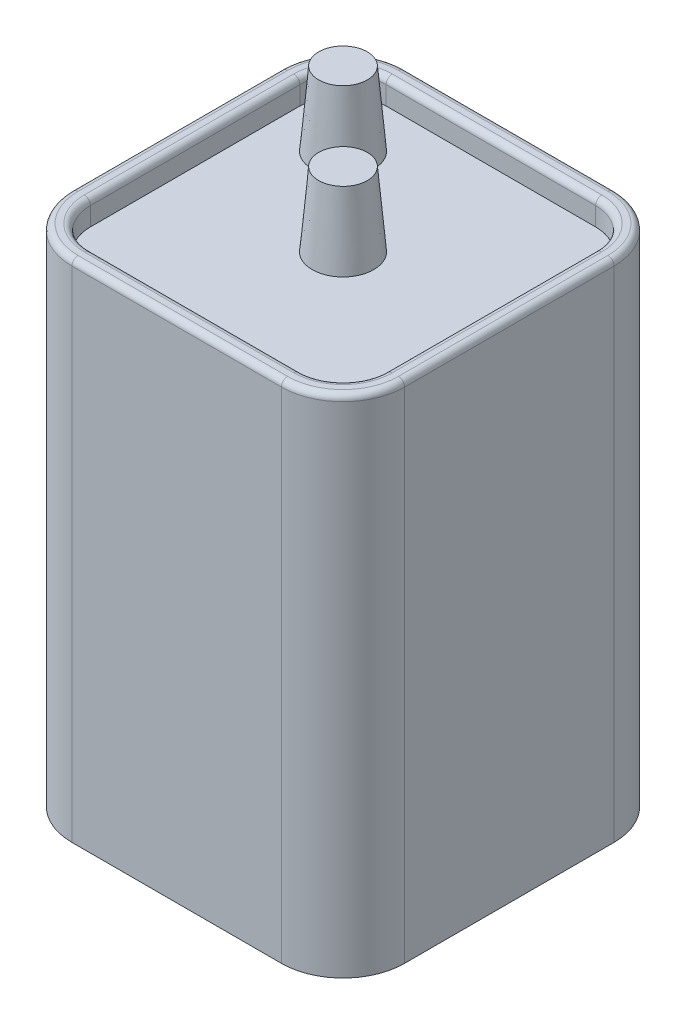
ISO-10303-21;
HEADER;
FILE_DESCRIPTION(('STEP AP214'),'2;1');
FILE_NAME('part.step','',(''),(''),'','','');
FILE_SCHEMA(('AUTOMOTIVE_DESIGN { 1 0 10303 214 1 1 1 1 }'));
ENDSEC;
DATA;
#1=APPLICATION_CONTEXT('core data for automotive mechanical design processes');
#2=APPLICATION_PROTOCOL_DEFINITION('international standard','automotive_design',2000,#1);
#3=PRODUCT_CONTEXT('',#1,'mechanical');
#4=PRODUCT('Part','Part','',(#3));
#5=PRODUCT_RELATED_PRODUCT_CATEGORY('part','',(#4));
#6=PRODUCT_DEFINITION_FORMATION('','',#4);
#7=PRODUCT_DEFINITION_CONTEXT('part definition',#1,'design');
#8=PRODUCT_DEFINITION('design','',#6,#7);
#9=PRODUCT_DEFINITION_SHAPE('','',#8);
#10=(LENGTH_UNIT() NAMED_UNIT(*) SI_UNIT(.MILLI.,.METRE.));
#11=(NAMED_UNIT(*) PLANE_ANGLE_UNIT() SI_UNIT($,.RADIAN.));
#12=(NAMED_UNIT(*) SI_UNIT($,.STERADIAN.) SOLID_ANGLE_UNIT());
#13=UNCERTAINTY_MEASURE_WITH_UNIT(LENGTH_MEASURE(1.E-05),#10,'distance_accuracy_value','');
#14=(GEOMETRIC_REPRESENTATION_CONTEXT(3) GLOBAL_UNCERTAINTY_ASSIGNED_CONTEXT((#13)) GLOBAL_UNIT_ASSIGNED_CONTEXT((#10,
#11,#12)) REPRESENTATION_CONTEXT('',''));
#15=CARTESIAN_POINT('',(0.,0.,0.));
#16=DIRECTION('',(0.,0.,1.));
#17=DIRECTION('',(1.,0.,0.));
#18=AXIS2_PLACEMENT_3D('',#15,#16,#17);
#19=CARTESIAN_POINT('',(34.29,104.14,-34.29));
#20=DIRECTION('',(-1.,0.,0.));
#21=DIRECTION('',(0.,0.,1.));
#22=AXIS2_PLACEMENT_3D('',#19,#20,#21);
#23=PLANE('',#22);
#24=DIRECTION('',(0.,-1.,0.));
#25=VECTOR('',#24,1.);
#26=CARTESIAN_POINT('',(34.29,104.14,-21.59));
#27=LINE('',#26,#25);
#28=CARTESIAN_POINT('',(34.29,0.,-21.59));
#29=VERTEX_POINT('',#28);
#30=CARTESIAN_POINT('',(34.29,102.87,-21.59));
#31=VERTEX_POINT('',#30);
#32=EDGE_CURVE('E300',#29,#31,#27,.F.);
#33=ORIENTED_EDGE('',*,*,#32,.T.);
#34=DIRECTION('',(0.,0.,-1.));
#35=VECTOR('',#34,1.);
#36=CARTESIAN_POINT('',(34.29,102.87,21.59));
#37=LINE('',#36,#35);
#38=CARTESIAN_POINT('',(34.29,102.87,21.59));
#39=VERTEX_POINT('',#38);
#40=EDGE_CURVE('E351',#31,#39,#37,.F.);
#41=ORIENTED_EDGE('',*,*,#40,.T.);
#42=DIRECTION('',(0.,-1.,0.));
#43=VECTOR('',#42,1.);
#44=CARTESIAN_POINT('',(34.29,104.14,21.59));
#45=LINE('',#44,#43);
#46=CARTESIAN_POINT('',(34.29,0.,21.59));
#47=VERTEX_POINT('',#46);
#48=EDGE_CURVE('E303',#39,#47,#45,.T.);
#49=ORIENTED_EDGE('',*,*,#48,.T.);
#50=DIRECTION('',(0.,0.,-1.));
#51=VECTOR('',#50,1.);
#52=CARTESIAN_POINT('',(34.29,0.,-34.29));
#53=LINE('',#52,#51);
#54=EDGE_CURVE('E256',#47,#29,#53,.T.);
#55=ORIENTED_EDGE('',*,*,#54,.T.);
#56=EDGE_LOOP('',(#33,#41,#49,#55));
#57=FACE_BOUND('',#56,.T.);
#58=ADVANCED_FACE('F45',(#57),#23,.F.);
#59=CARTESIAN_POINT('',(-34.29,104.14,-34.29));
#60=DIRECTION('',(0.,0.,1.));
#61=DIRECTION('',(1.,0.,0.));
#62=AXIS2_PLACEMENT_3D('',#59,#60,#61);
#63=PLANE('',#62);
#64=DIRECTION('',(0.,-1.,0.));
#65=VECTOR('',#64,1.);
#66=CARTESIAN_POINT('',(-21.59,104.14,-34.29));
#67=LINE('',#66,#65);
#68=CARTESIAN_POINT('',(-21.59,0.,-34.29));
#69=VERTEX_POINT('',#68);
#70=CARTESIAN_POINT('',(-21.59,102.87,-34.29));
#71=VERTEX_POINT('',#70);
#72=EDGE_CURVE('E305',#69,#71,#67,.F.);
#73=ORIENTED_EDGE('',*,*,#72,.T.);
#74=DIRECTION('',(-1.,0.,0.));
#75=VECTOR('',#74,1.);
#76=CARTESIAN_POINT('',(21.59,102.87,-34.29));
#77=LINE('',#76,#75);
#78=CARTESIAN_POINT('',(21.59,102.87,-34.29));
#79=VERTEX_POINT('',#78);
#80=EDGE_CURVE('E347',#71,#79,#77,.F.);
#81=ORIENTED_EDGE('',*,*,#80,.T.);
#82=DIRECTION('',(0.,-1.,0.));
#83=VECTOR('',#82,1.);
#84=CARTESIAN_POINT('',(21.59,104.14,-34.29));
#85=LINE('',#84,#83);
#86=CARTESIAN_POINT('',(21.59,0.,-34.29));
#87=VERTEX_POINT('',#86);
#88=EDGE_CURVE('E308',#79,#87,#85,.T.);
#89=ORIENTED_EDGE('',*,*,#88,.T.);
#90=DIRECTION('',(-1.,0.,0.));
#91=VECTOR('',#90,1.);
#92=CARTESIAN_POINT('',(-34.29,0.,-34.29));
#93=LINE('',#92,#91);
#94=EDGE_CURVE('E273',#87,#69,#93,.T.);
#95=ORIENTED_EDGE('',*,*,#94,.T.);
#96=EDGE_LOOP('',(#73,#81,#89,#95));
#97=FACE_BOUND('',#96,.T.);
#98=ADVANCED_FACE('F461',(#97),#63,.F.);
#99=CARTESIAN_POINT('',(-34.29,104.14,-34.29));
#100=DIRECTION('',(1.,0.,0.));
#101=DIRECTION('',(0.,0.,-1.));
#102=AXIS2_PLACEMENT_3D('',#99,#100,#101);
#103=PLANE('',#102);
#104=DIRECTION('',(0.,-1.,0.));
#105=VECTOR('',#104,1.);
#106=CARTESIAN_POINT('',(-34.29,104.14,21.59));
#107=LINE('',#106,#105);
#108=CARTESIAN_POINT('',(-34.29,0.,21.59));
#109=VERTEX_POINT('',#108);
#110=CARTESIAN_POINT('',(-34.29,102.87,21.59));
#111=VERTEX_POINT('',#110);
#112=EDGE_CURVE('E297',#109,#111,#107,.F.);
#113=ORIENTED_EDGE('',*,*,#112,.T.);
#114=DIRECTION('',(0.,0.,1.));
#115=VECTOR('',#114,1.);
#116=CARTESIAN_POINT('',(-34.29,102.87,-21.59));
#117=LINE('',#116,#115);
#118=CARTESIAN_POINT('',(-34.29,102.87,-21.59));
#119=VERTEX_POINT('',#118);
#120=EDGE_CURVE('E359',#111,#119,#117,.F.);
#121=ORIENTED_EDGE('',*,*,#120,.T.);
#122=DIRECTION('',(0.,-1.,0.));
#123=VECTOR('',#122,1.);
#124=CARTESIAN_POINT('',(-34.29,104.14,-21.59));
#125=LINE('',#124,#123);
#126=CARTESIAN_POINT('',(-34.29,0.,-21.59));
#127=VERTEX_POINT('',#126);
#128=EDGE_CURVE('E295',#119,#127,#125,.T.);
#129=ORIENTED_EDGE('',*,*,#128,.T.);
#130=DIRECTION('',(0.,0.,1.));
#131=VECTOR('',#130,1.);
#132=CARTESIAN_POINT('',(-34.29,0.,-34.29));
#133=LINE('',#132,#131);
#134=EDGE_CURVE('E276',#127,#109,#133,.T.);
#135=ORIENTED_EDGE('',*,*,#134,.T.);
#136=EDGE_LOOP('',(#113,#121,#129,#135));
#137=FACE_BOUND('',#136,.T.);
#138=ADVANCED_FACE('F467',(#137),#103,.F.);
#139=CARTESIAN_POINT('',(-34.29,104.14,34.29));
#140=DIRECTION('',(0.,0.,-1.));
#141=DIRECTION('',(-1.,0.,0.));
#142=AXIS2_PLACEMENT_3D('',#139,#140,#141);
#143=PLANE('',#142);
#144=DIRECTION('',(0.,-1.,0.));
#145=VECTOR('',#144,1.);
#146=CARTESIAN_POINT('',(21.59,104.14,34.29));
#147=LINE('',#146,#145);
#148=CARTESIAN_POINT('',(21.59,0.,34.29));
#149=VERTEX_POINT('',#148);
#150=CARTESIAN_POINT('',(21.59,102.87,34.29));
#151=VERTEX_POINT('',#150);
#152=EDGE_CURVE('E282',#149,#151,#147,.F.);
#153=ORIENTED_EDGE('',*,*,#152,.T.);
#154=DIRECTION('',(1.,0.,0.));
#155=VECTOR('',#154,1.);
#156=CARTESIAN_POINT('',(-21.59,102.87,34.29));
#157=LINE('',#156,#155);
#158=CARTESIAN_POINT('',(-21.59,102.87,34.29));
#159=VERTEX_POINT('',#158);
#160=EDGE_CURVE('E355',#151,#159,#157,.F.);
#161=ORIENTED_EDGE('',*,*,#160,.T.);
#162=DIRECTION('',(0.,-1.,0.));
#163=VECTOR('',#162,1.);
#164=CARTESIAN_POINT('',(-21.59,104.14,34.29));
#165=LINE('',#164,#163);
#166=CARTESIAN_POINT('',(-21.59,0.,34.29));
#167=VERTEX_POINT('',#166);
#168=EDGE_CURVE('E285',#159,#167,#165,.T.);
#169=ORIENTED_EDGE('',*,*,#168,.T.);
#170=DIRECTION('',(1.,0.,0.));
#171=VECTOR('',#170,1.);
#172=CARTESIAN_POINT('',(-34.29,0.,34.29));
#173=LINE('',#172,#171);
#174=EDGE_CURVE('E279',#167,#149,#173,.T.);
#175=ORIENTED_EDGE('',*,*,#174,.T.);
#176=EDGE_LOOP('',(#153,#161,#169,#175));
#177=FACE_BOUND('',#176,.T.);
#178=ADVANCED_FACE('F666',(#177),#143,.F.);
#179=CARTESIAN_POINT('',(0.,104.14,0.));
#180=DIRECTION('',(0.,1.,0.));
#181=DIRECTION('',(0.,0.,1.));
#182=AXIS2_PLACEMENT_3D('',#179,#180,#181);
#183=PLANE('',#182);
#184=DIRECTION('',(-1.,0.,0.));
#185=VECTOR('',#184,1.);
#186=CARTESIAN_POINT('',(-21.59,104.14,-33.02));
#187=LINE('',#186,#185);
#188=CARTESIAN_POINT('',(21.59,104.14,-33.02));
#189=VERTEX_POINT('',#188);
#190=CARTESIAN_POINT('',(-21.59,104.14,-33.02));
#191=VERTEX_POINT('',#190);
#192=EDGE_CURVE('E339',#189,#191,#187,.T.);
#193=ORIENTED_EDGE('',*,*,#192,.T.);
#194=CARTESIAN_POINT('',(-21.59,104.14,-21.59));
#195=DIRECTION('',(0.,1.,0.));
#196=DIRECTION('',(0.,0.,1.));
#197=AXIS2_PLACEMENT_3D('',#194,#195,#196);
#198=CIRCLE('',#197,11.43);
#199=CARTESIAN_POINT('',(-33.02,104.14,-21.59));
#200=VERTEX_POINT('',#199);
#201=EDGE_CURVE('E341',#191,#200,#198,.T.);
#202=ORIENTED_EDGE('',*,*,#201,.T.);
#203=DIRECTION('',(0.,0.,1.));
#204=VECTOR('',#203,1.);
#205=CARTESIAN_POINT('',(-33.02,104.14,21.59));
#206=LINE('',#205,#204);
#207=CARTESIAN_POINT('',(-33.02,104.14,21.59));
#208=VERTEX_POINT('',#207);
#209=EDGE_CURVE('E327',#200,#208,#206,.T.);
#210=ORIENTED_EDGE('',*,*,#209,.T.);
#211=CARTESIAN_POINT('',(-21.59,104.14,21.59));
#212=DIRECTION('',(0.,1.,0.));
#213=DIRECTION('',(0.,0.,1.));
#214=AXIS2_PLACEMENT_3D('',#211,#212,#213);
#215=CIRCLE('',#214,11.43);
#216=CARTESIAN_POINT('',(-21.59,104.14,33.02));
#217=VERTEX_POINT('',#216);
#218=EDGE_CURVE('E329',#208,#217,#215,.T.);
#219=ORIENTED_EDGE('',*,*,#218,.T.);
#220=DIRECTION('',(1.,0.,0.));
#221=VECTOR('',#220,1.);
#222=CARTESIAN_POINT('',(21.59,104.14,33.02));
#223=LINE('',#222,#221);
#224=CARTESIAN_POINT('',(21.59,104.14,33.02));
#225=VERTEX_POINT('',#224);
#226=EDGE_CURVE('E331',#217,#225,#223,.T.);
#227=ORIENTED_EDGE('',*,*,#226,.T.);
#228=CARTESIAN_POINT('',(21.59,104.14,21.59));
#229=DIRECTION('',(0.,1.,0.));
#230=DIRECTION('',(0.,0.,1.));
#231=AXIS2_PLACEMENT_3D('',#228,#229,#230);
#232=CIRCLE('',#231,11.43);
#233=CARTESIAN_POINT('',(33.02,104.14,21.59));
#234=VERTEX_POINT('',#233);
#235=EDGE_CURVE('E333',#225,#234,#232,.T.);
#236=ORIENTED_EDGE('',*,*,#235,.T.);
#237=DIRECTION('',(0.,0.,-1.));
#238=VECTOR('',#237,1.);
#239=CARTESIAN_POINT('',(33.02,104.14,-21.59));
#240=LINE('',#239,#238);
#241=CARTESIAN_POINT('',(33.02,104.14,-21.59));
#242=VERTEX_POINT('',#241);
#243=EDGE_CURVE('E335',#234,#242,#240,.T.);
#244=ORIENTED_EDGE('',*,*,#243,.T.);
#245=CARTESIAN_POINT('',(21.59,104.14,-21.59));
#246=DIRECTION('',(0.,1.,0.));
#247=DIRECTION('',(0.,0.,1.));
#248=AXIS2_PLACEMENT_3D('',#245,#246,#247);
#249=CIRCLE('',#248,11.43);
#250=EDGE_CURVE('E337',#242,#189,#249,.T.);
#251=ORIENTED_EDGE('',*,*,#250,.T.);
#252=EDGE_LOOP('',(#193,#202,#210,#219,#227,#236,#244,#251));
#253=FACE_BOUND('',#252,.T.);
#254=CARTESIAN_POINT('',(-21.59,104.14,21.59));
#255=DIRECTION('',(0.,1.,0.));
#256=DIRECTION('',(0.,0.,1.));
#257=AXIS2_PLACEMENT_3D('',#254,#255,#256);
#258=CIRCLE('',#257,10.16);
#259=CARTESIAN_POINT('',(-21.59,104.14,31.75));
#260=VERTEX_POINT('',#259);
#261=CARTESIAN_POINT('',(-31.75,104.14,21.59));
#262=VERTEX_POINT('',#261);
#263=EDGE_CURVE('E322',#260,#262,#258,.F.);
#264=ORIENTED_EDGE('',*,*,#263,.T.);
#265=DIRECTION('',(0.,0.,1.));
#266=VECTOR('',#265,1.);
#267=CARTESIAN_POINT('',(-31.75,104.14,-21.59));
#268=LINE('',#267,#266);
#269=CARTESIAN_POINT('',(-31.75,104.14,-21.59));
#270=VERTEX_POINT('',#269);
#271=EDGE_CURVE('E324',#262,#270,#268,.F.);
#272=ORIENTED_EDGE('',*,*,#271,.T.);
#273=CARTESIAN_POINT('',(-21.59,104.14,-21.59));
#274=DIRECTION('',(0.,1.,0.));
#275=DIRECTION('',(0.,0.,1.));
#276=AXIS2_PLACEMENT_3D('',#273,#274,#275);
#277=CIRCLE('',#276,10.16);
#278=CARTESIAN_POINT('',(-21.59,104.14,-31.75));
#279=VERTEX_POINT('',#278);
#280=EDGE_CURVE('E310',#270,#279,#277,.F.);
#281=ORIENTED_EDGE('',*,*,#280,.T.);
#282=DIRECTION('',(-1.,0.,0.));
#283=VECTOR('',#282,1.);
#284=CARTESIAN_POINT('',(21.59,104.14,-31.75));
#285=LINE('',#284,#283);
#286=CARTESIAN_POINT('',(21.59,104.14,-31.75));
#287=VERTEX_POINT('',#286);
#288=EDGE_CURVE('E312',#279,#287,#285,.F.);
#289=ORIENTED_EDGE('',*,*,#288,.T.);
#290=CARTESIAN_POINT('',(21.59,104.14,-21.59));
#291=DIRECTION('',(0.,1.,0.));
#292=DIRECTION('',(0.,0.,1.));
#293=AXIS2_PLACEMENT_3D('',#290,#291,#292);
#294=CIRCLE('',#293,10.16);
#295=CARTESIAN_POINT('',(31.75,104.14,-21.59));
#296=VERTEX_POINT('',#295);
#297=EDGE_CURVE('E314',#287,#296,#294,.F.);
#298=ORIENTED_EDGE('',*,*,#297,.T.);
#299=DIRECTION('',(0.,0.,-1.));
#300=VECTOR('',#299,1.);
#301=CARTESIAN_POINT('',(31.75,104.14,21.59));
#302=LINE('',#301,#300);
#303=CARTESIAN_POINT('',(31.75,104.14,21.59));
#304=VERTEX_POINT('',#303);
#305=EDGE_CURVE('E316',#296,#304,#302,.F.);
#306=ORIENTED_EDGE('',*,*,#305,.T.);
#307=CARTESIAN_POINT('',(21.59,104.14,21.59));
#308=DIRECTION('',(0.,1.,0.));
#309=DIRECTION('',(0.,0.,1.));
#310=AXIS2_PLACEMENT_3D('',#307,#308,#309);
#311=CIRCLE('',#310,10.16);
#312=CARTESIAN_POINT('',(21.59,104.14,31.75));
#313=VERTEX_POINT('',#312);
#314=EDGE_CURVE('E318',#304,#313,#311,.F.);
#315=ORIENTED_EDGE('',*,*,#314,.T.);
#316=DIRECTION('',(1.,0.,0.));
#317=VECTOR('',#316,1.);
#318=CARTESIAN_POINT('',(-21.59,104.14,31.75));
#319=LINE('',#318,#317);
#320=EDGE_CURVE('E320',#313,#260,#319,.F.);
#321=ORIENTED_EDGE('',*,*,#320,.T.);
#322=EDGE_LOOP('',(#264,#272,#281,#289,#298,#306,#315,#321));
#323=FACE_BOUND('',#322,.T.);
#324=ADVANCED_FACE('F422',(#253,#323),#183,.T.);
#325=CARTESIAN_POINT('',(0.,0.,0.));
#326=DIRECTION('',(0.,1.,0.));
#327=DIRECTION('',(0.,0.,1.));
#328=AXIS2_PLACEMENT_3D('',#325,#326,#327);
#329=PLANE('',#328);
#330=ORIENTED_EDGE('',*,*,#174,.F.);
#331=CARTESIAN_POINT('',(-21.59,0.,21.59));
#332=DIRECTION('',(0.,1.,0.));
#333=DIRECTION('',(0.,0.,1.));
#334=AXIS2_PLACEMENT_3D('',#331,#332,#333);
#335=CIRCLE('',#334,12.7);
#336=EDGE_CURVE('E293',#167,#109,#335,.F.);
#337=ORIENTED_EDGE('',*,*,#336,.T.);
#338=ORIENTED_EDGE('',*,*,#134,.F.);
#339=CARTESIAN_POINT('',(-21.59,0.,-21.59));
#340=DIRECTION('',(0.,1.,0.));
#341=DIRECTION('',(0.,0.,1.));
#342=AXIS2_PLACEMENT_3D('',#339,#340,#341);
#343=CIRCLE('',#342,12.7);
#344=EDGE_CURVE('E287',#127,#69,#343,.F.);
#345=ORIENTED_EDGE('',*,*,#344,.T.);
#346=ORIENTED_EDGE('',*,*,#94,.F.);
#347=CARTESIAN_POINT('',(21.59,0.,-21.59));
#348=DIRECTION('',(0.,1.,0.));
#349=DIRECTION('',(0.,0.,1.));
#350=AXIS2_PLACEMENT_3D('',#347,#348,#349);
#351=CIRCLE('',#350,12.7);
#352=EDGE_CURVE('E289',#87,#29,#351,.F.);
#353=ORIENTED_EDGE('',*,*,#352,.T.);
#354=ORIENTED_EDGE('',*,*,#54,.F.);
#355=CARTESIAN_POINT('',(21.59,0.,21.59));
#356=DIRECTION('',(0.,1.,0.));
#357=DIRECTION('',(0.,0.,1.));
#358=AXIS2_PLACEMENT_3D('',#355,#356,#357);
#359=CIRCLE('',#358,12.7);
#360=EDGE_CURVE('E291',#47,#149,#359,.F.);
#361=ORIENTED_EDGE('',*,*,#360,.T.);
#362=EDGE_LOOP('',(#330,#337,#338,#345,#346,#353,#354,#361));
#363=FACE_BOUND('',#362,.T.);
#364=ADVANCED_FACE('F476',(#363),#329,.F.);
#365=CARTESIAN_POINT('',(-21.59,104.14,21.59));
#366=DIRECTION('',(0.,-1.,0.));
#367=DIRECTION('',(0.,0.,-1.));
#368=AXIS2_PLACEMENT_3D('',#365,#366,#367);
#369=CYLINDRICAL_SURFACE('',#368,12.7);
#370=ORIENTED_EDGE('',*,*,#168,.F.);
#371=CARTESIAN_POINT('',(-21.59,102.87,21.59));
#372=DIRECTION('',(0.,1.,0.));
#373=DIRECTION('',(0.,0.,1.));
#374=AXIS2_PLACEMENT_3D('',#371,#372,#373);
#375=CIRCLE('',#374,12.7);
#376=EDGE_CURVE('E357',#159,#111,#375,.F.);
#377=ORIENTED_EDGE('',*,*,#376,.T.);
#378=ORIENTED_EDGE('',*,*,#112,.F.);
#379=ORIENTED_EDGE('',*,*,#336,.F.);
#380=EDGE_LOOP('',(#370,#377,#378,#379));
#381=FACE_BOUND('',#380,.T.);
#382=ADVANCED_FACE('F472',(#381),#369,.T.);
#383=CARTESIAN_POINT('',(21.59,104.14,21.59));
#384=DIRECTION('',(0.,-1.,0.));
#385=DIRECTION('',(0.,0.,-1.));
#386=AXIS2_PLACEMENT_3D('',#383,#384,#385);
#387=CYLINDRICAL_SURFACE('',#386,12.7);
#388=ORIENTED_EDGE('',*,*,#48,.F.);
#389=CARTESIAN_POINT('',(21.59,102.87,21.59));
#390=DIRECTION('',(0.,1.,0.));
#391=DIRECTION('',(0.,0.,1.));
#392=AXIS2_PLACEMENT_3D('',#389,#390,#391);
#393=CIRCLE('',#392,12.7);
#394=EDGE_CURVE('E353',#39,#151,#393,.F.);
#395=ORIENTED_EDGE('',*,*,#394,.T.);
#396=ORIENTED_EDGE('',*,*,#152,.F.);
#397=ORIENTED_EDGE('',*,*,#360,.F.);
#398=EDGE_LOOP('',(#388,#395,#396,#397));
#399=FACE_BOUND('',#398,.T.);
#400=ADVANCED_FACE('F475',(#399),#387,.T.);
#401=CARTESIAN_POINT('',(21.59,104.14,-21.59));
#402=DIRECTION('',(0.,-1.,0.));
#403=DIRECTION('',(0.,0.,-1.));
#404=AXIS2_PLACEMENT_3D('',#401,#402,#403);
#405=CYLINDRICAL_SURFACE('',#404,12.7);
#406=ORIENTED_EDGE('',*,*,#88,.F.);
#407=CARTESIAN_POINT('',(21.59,102.87,-21.59));
#408=DIRECTION('',(0.,1.,0.));
#409=DIRECTION('',(0.,0.,1.));
#410=AXIS2_PLACEMENT_3D('',#407,#408,#409);
#411=CIRCLE('',#410,12.7);
#412=EDGE_CURVE('E349',#79,#31,#411,.F.);
#413=ORIENTED_EDGE('',*,*,#412,.T.);
#414=ORIENTED_EDGE('',*,*,#32,.F.);
#415=ORIENTED_EDGE('',*,*,#352,.F.);
#416=EDGE_LOOP('',(#406,#413,#414,#415));
#417=FACE_BOUND('',#416,.T.);
#418=ADVANCED_FACE('F480',(#417),#405,.T.);
#419=CARTESIAN_POINT('',(-21.59,104.14,-21.59));
#420=DIRECTION('',(0.,-1.,0.));
#421=DIRECTION('',(0.,0.,-1.));
#422=AXIS2_PLACEMENT_3D('',#419,#420,#421);
#423=CYLINDRICAL_SURFACE('',#422,12.7);
#424=ORIENTED_EDGE('',*,*,#128,.F.);
#425=CARTESIAN_POINT('',(-21.59,102.87,-21.59));
#426=DIRECTION('',(0.,1.,0.));
#427=DIRECTION('',(0.,0.,1.));
#428=AXIS2_PLACEMENT_3D('',#425,#426,#427);
#429=CIRCLE('',#428,12.7);
#430=EDGE_CURVE('E344',#119,#71,#429,.F.);
#431=ORIENTED_EDGE('',*,*,#430,.T.);
#432=ORIENTED_EDGE('',*,*,#72,.F.);
#433=ORIENTED_EDGE('',*,*,#344,.F.);
#434=EDGE_LOOP('',(#424,#431,#432,#433));
#435=FACE_BOUND('',#434,.T.);
#436=ADVANCED_FACE('F484',(#435),#423,.T.);
#437=CARTESIAN_POINT('',(-21.59,99.06,-21.59));
#438=DIRECTION('',(0.,1.,0.));
#439=DIRECTION('',(0.,0.,1.));
#440=AXIS2_PLACEMENT_3D('',#437,#438,#439);
#441=CYLINDRICAL_SURFACE('',#440,8.89);
#442=DIRECTION('',(0.,1.,0.));
#443=VECTOR('',#442,1.);
#444=CARTESIAN_POINT('',(-21.59,99.06,-30.48));
#445=LINE('',#444,#443);
#446=CARTESIAN_POINT('',(-21.59,99.06,-30.48));
#447=VERTEX_POINT('',#446);
#448=CARTESIAN_POINT('',(-21.59,102.87,-30.48));
#449=VERTEX_POINT('',#448);
#450=EDGE_CURVE('E254',#447,#449,#445,.T.);
#451=ORIENTED_EDGE('',*,*,#450,.T.);
#452=CARTESIAN_POINT('',(-21.59,102.87,-21.59));
#453=DIRECTION('',(0.,1.,0.));
#454=DIRECTION('',(0.,0.,1.));
#455=AXIS2_PLACEMENT_3D('',#452,#453,#454);
#456=CIRCLE('',#455,8.89);
#457=CARTESIAN_POINT('',(-30.48,102.87,-21.59));
#458=VERTEX_POINT('',#457);
#459=EDGE_CURVE('E13',#449,#458,#456,.T.);
#460=ORIENTED_EDGE('',*,*,#459,.T.);
#461=DIRECTION('',(0.,1.,0.));
#462=VECTOR('',#461,1.);
#463=CARTESIAN_POINT('',(-30.48,99.06,-21.59));
#464=LINE('',#463,#462);
#465=CARTESIAN_POINT('',(-30.48,99.06,-21.59));
#466=VERTEX_POINT('',#465);
#467=EDGE_CURVE('E207',#466,#458,#464,.T.);
#468=ORIENTED_EDGE('',*,*,#467,.F.);
#469=CARTESIAN_POINT('',(-21.59,99.06,-21.59));
#470=DIRECTION('',(0.,1.,0.));
#471=DIRECTION('',(0.,0.,1.));
#472=AXIS2_PLACEMENT_3D('',#469,#470,#471);
#473=CIRCLE('',#472,8.89);
#474=EDGE_CURVE('E211',#447,#466,#473,.T.);
#475=ORIENTED_EDGE('',*,*,#474,.F.);
#476=EDGE_LOOP('',(#451,#460,#468,#475));
#477=FACE_BOUND('',#476,.T.);
#478=ADVANCED_FACE('F209',(#477),#441,.F.);
#479=CARTESIAN_POINT('',(21.59,99.06,-30.48));
#480=DIRECTION('',(0.,0.,-1.));
#481=DIRECTION('',(-1.,0.,0.));
#482=AXIS2_PLACEMENT_3D('',#479,#480,#481);
#483=PLANE('',#482);
#484=DIRECTION('',(0.,1.,0.));
#485=VECTOR('',#484,1.);
#486=CARTESIAN_POINT('',(21.59,99.06,-30.48));
#487=LINE('',#486,#485);
#488=CARTESIAN_POINT('',(21.59,99.06,-30.48));
#489=VERTEX_POINT('',#488);
#490=CARTESIAN_POINT('',(21.59,102.87,-30.48));
#491=VERTEX_POINT('',#490);
#492=EDGE_CURVE('E257',#489,#491,#487,.T.);
#493=ORIENTED_EDGE('',*,*,#492,.T.);
#494=DIRECTION('',(-1.,0.,0.));
#495=VECTOR('',#494,1.);
#496=CARTESIAN_POINT('',(-21.59,102.87,-30.48));
#497=LINE('',#496,#495);
#498=EDGE_CURVE('E54',#491,#449,#497,.T.);
#499=ORIENTED_EDGE('',*,*,#498,.T.);
#500=ORIENTED_EDGE('',*,*,#450,.F.);
#501=DIRECTION('',(-1.,0.,0.));
#502=VECTOR('',#501,1.);
#503=CARTESIAN_POINT('',(21.59,99.06,-30.48));
#504=LINE('',#503,#502);
#505=EDGE_CURVE('E218',#489,#447,#504,.T.);
#506=ORIENTED_EDGE('',*,*,#505,.F.);
#507=EDGE_LOOP('',(#493,#499,#500,#506));
#508=FACE_BOUND('',#507,.T.);
#509=ADVANCED_FACE('F450',(#508),#483,.F.);
#510=CARTESIAN_POINT('',(21.59,99.06,-21.59));
#511=DIRECTION('',(0.,1.,0.));
#512=DIRECTION('',(0.,0.,1.));
#513=AXIS2_PLACEMENT_3D('',#510,#511,#512);
#514=CYLINDRICAL_SURFACE('',#513,8.89);
#515=DIRECTION('',(0.,1.,0.));
#516=VECTOR('',#515,1.);
#517=CARTESIAN_POINT('',(30.48,99.06,-21.59));
#518=LINE('',#517,#516);
#519=CARTESIAN_POINT('',(30.48,99.06,-21.59));
#520=VERTEX_POINT('',#519);
#521=CARTESIAN_POINT('',(30.48,102.87,-21.59));
#522=VERTEX_POINT('',#521);
#523=EDGE_CURVE('E259',#520,#522,#518,.T.);
#524=ORIENTED_EDGE('',*,*,#523,.T.);
#525=CARTESIAN_POINT('',(21.59,102.87,-21.59));
#526=DIRECTION('',(0.,1.,0.));
#527=DIRECTION('',(0.,0.,1.));
#528=AXIS2_PLACEMENT_3D('',#525,#526,#527);
#529=CIRCLE('',#528,8.89);
#530=EDGE_CURVE('E69',#522,#491,#529,.T.);
#531=ORIENTED_EDGE('',*,*,#530,.T.);
#532=ORIENTED_EDGE('',*,*,#492,.F.);
#533=CARTESIAN_POINT('',(21.59,99.06,-21.59));
#534=DIRECTION('',(0.,1.,0.));
#535=DIRECTION('',(0.,0.,1.));
#536=AXIS2_PLACEMENT_3D('',#533,#534,#535);
#537=CIRCLE('',#536,8.89);
#538=EDGE_CURVE('E251',#520,#489,#537,.T.);
#539=ORIENTED_EDGE('',*,*,#538,.F.);
#540=EDGE_LOOP('',(#524,#531,#532,#539));
#541=FACE_BOUND('',#540,.T.);
#542=ADVANCED_FACE('F451',(#541),#514,.F.);
#543=CARTESIAN_POINT('',(30.48,99.06,21.59));
#544=DIRECTION('',(1.,0.,0.));
#545=DIRECTION('',(0.,0.,-1.));
#546=AXIS2_PLACEMENT_3D('',#543,#544,#545);
#547=PLANE('',#546);
#548=DIRECTION('',(0.,1.,0.));
#549=VECTOR('',#548,1.);
#550=CARTESIAN_POINT('',(30.48,99.06,21.59));
#551=LINE('',#550,#549);
#552=CARTESIAN_POINT('',(30.48,99.06,21.59));
#553=VERTEX_POINT('',#552);
#554=CARTESIAN_POINT('',(30.48,102.87,21.59));
#555=VERTEX_POINT('',#554);
#556=EDGE_CURVE('E261',#553,#555,#551,.T.);
#557=ORIENTED_EDGE('',*,*,#556,.T.);
#558=DIRECTION('',(0.,0.,-1.));
#559=VECTOR('',#558,1.);
#560=CARTESIAN_POINT('',(30.48,102.87,-21.59));
#561=LINE('',#560,#559);
#562=EDGE_CURVE('E369',#555,#522,#561,.T.);
#563=ORIENTED_EDGE('',*,*,#562,.T.);
#564=ORIENTED_EDGE('',*,*,#523,.F.);
#565=DIRECTION('',(0.,0.,-1.));
#566=VECTOR('',#565,1.);
#567=CARTESIAN_POINT('',(30.48,99.06,21.59));
#568=LINE('',#567,#566);
#569=EDGE_CURVE('E248',#553,#520,#568,.T.);
#570=ORIENTED_EDGE('',*,*,#569,.F.);
#571=EDGE_LOOP('',(#557,#563,#564,#570));
#572=FACE_BOUND('',#571,.T.);
#573=ADVANCED_FACE('F448',(#572),#547,.F.);
#574=CARTESIAN_POINT('',(21.59,99.06,21.59));
#575=DIRECTION('',(0.,1.,0.));
#576=DIRECTION('',(0.,0.,1.));
#577=AXIS2_PLACEMENT_3D('',#574,#575,#576);
#578=CYLINDRICAL_SURFACE('',#577,8.89);
#579=DIRECTION('',(0.,1.,0.));
#580=VECTOR('',#579,1.);
#581=CARTESIAN_POINT('',(21.59,99.06,30.48));
#582=LINE('',#581,#580);
#583=CARTESIAN_POINT('',(21.59,99.06,30.48));
#584=VERTEX_POINT('',#583);
#585=CARTESIAN_POINT('',(21.59,102.87,30.48));
#586=VERTEX_POINT('',#585);
#587=EDGE_CURVE('E264',#584,#586,#582,.T.);
#588=ORIENTED_EDGE('',*,*,#587,.T.);
#589=CARTESIAN_POINT('',(21.59,102.87,21.59));
#590=DIRECTION('',(0.,1.,0.));
#591=DIRECTION('',(0.,0.,1.));
#592=AXIS2_PLACEMENT_3D('',#589,#590,#591);
#593=CIRCLE('',#592,8.89);
#594=EDGE_CURVE('E367',#586,#555,#593,.T.);
#595=ORIENTED_EDGE('',*,*,#594,.T.);
#596=ORIENTED_EDGE('',*,*,#556,.F.);
#597=CARTESIAN_POINT('',(21.59,99.06,21.59));
#598=DIRECTION('',(0.,1.,0.));
#599=DIRECTION('',(0.,0.,1.));
#600=AXIS2_PLACEMENT_3D('',#597,#598,#599);
#601=CIRCLE('',#600,8.89);
#602=EDGE_CURVE('E245',#584,#553,#601,.T.);
#603=ORIENTED_EDGE('',*,*,#602,.F.);
#604=EDGE_LOOP('',(#588,#595,#596,#603));
#605=FACE_BOUND('',#604,.T.);
#606=ADVANCED_FACE('F445',(#605),#578,.F.);
#607=CARTESIAN_POINT('',(-21.59,99.06,30.48));
#608=DIRECTION('',(0.,0.,1.));
#609=DIRECTION('',(1.,0.,0.));
#610=AXIS2_PLACEMENT_3D('',#607,#608,#609);
#611=PLANE('',#610);
#612=DIRECTION('',(0.,1.,0.));
#613=VECTOR('',#612,1.);
#614=CARTESIAN_POINT('',(-21.59,99.06,30.48));
#615=LINE('',#614,#613);
#616=CARTESIAN_POINT('',(-21.59,99.06,30.48));
#617=VERTEX_POINT('',#616);
#618=CARTESIAN_POINT('',(-21.59,102.87,30.48));
#619=VERTEX_POINT('',#618);
#620=EDGE_CURVE('E267',#617,#619,#615,.T.);
#621=ORIENTED_EDGE('',*,*,#620,.T.);
#622=DIRECTION('',(1.,0.,0.));
#623=VECTOR('',#622,1.);
#624=CARTESIAN_POINT('',(21.59,102.87,30.48));
#625=LINE('',#624,#623);
#626=EDGE_CURVE('E365',#619,#586,#625,.T.);
#627=ORIENTED_EDGE('',*,*,#626,.T.);
#628=ORIENTED_EDGE('',*,*,#587,.F.);
#629=DIRECTION('',(1.,0.,0.));
#630=VECTOR('',#629,1.);
#631=CARTESIAN_POINT('',(-21.59,99.06,30.48));
#632=LINE('',#631,#630);
#633=EDGE_CURVE('E242',#617,#584,#632,.T.);
#634=ORIENTED_EDGE('',*,*,#633,.F.);
#635=EDGE_LOOP('',(#621,#627,#628,#634));
#636=FACE_BOUND('',#635,.T.);
#637=ADVANCED_FACE('F442',(#636),#611,.F.);
#638=CARTESIAN_POINT('',(-21.59,99.06,21.59));
#639=DIRECTION('',(0.,1.,0.));
#640=DIRECTION('',(0.,0.,1.));
#641=AXIS2_PLACEMENT_3D('',#638,#639,#640);
#642=CYLINDRICAL_SURFACE('',#641,8.89);
#643=DIRECTION('',(0.,1.,0.));
#644=VECTOR('',#643,1.);
#645=CARTESIAN_POINT('',(-30.48,99.06,21.59));
#646=LINE('',#645,#644);
#647=CARTESIAN_POINT('',(-30.48,99.06,21.59));
#648=VERTEX_POINT('',#647);
#649=CARTESIAN_POINT('',(-30.48,102.87,21.59));
#650=VERTEX_POINT('',#649);
#651=EDGE_CURVE('E217',#648,#650,#646,.T.);
#652=ORIENTED_EDGE('',*,*,#651,.T.);
#653=CARTESIAN_POINT('',(-21.59,102.87,21.59));
#654=DIRECTION('',(0.,1.,0.));
#655=DIRECTION('',(0.,0.,1.));
#656=AXIS2_PLACEMENT_3D('',#653,#654,#655);
#657=CIRCLE('',#656,8.89);
#658=EDGE_CURVE('E363',#650,#619,#657,.T.);
#659=ORIENTED_EDGE('',*,*,#658,.T.);
#660=ORIENTED_EDGE('',*,*,#620,.F.);
#661=CARTESIAN_POINT('',(-21.59,99.06,21.59));
#662=DIRECTION('',(0.,1.,0.));
#663=DIRECTION('',(0.,0.,1.));
#664=AXIS2_PLACEMENT_3D('',#661,#662,#663);
#665=CIRCLE('',#664,8.89);
#666=EDGE_CURVE('E227',#648,#617,#665,.T.);
#667=ORIENTED_EDGE('',*,*,#666,.F.);
#668=EDGE_LOOP('',(#652,#659,#660,#667));
#669=FACE_BOUND('',#668,.T.);
#670=ADVANCED_FACE('F438',(#669),#642,.F.);
#671=CARTESIAN_POINT('',(-30.48,99.06,-21.59));
#672=DIRECTION('',(-1.,0.,0.));
#673=DIRECTION('',(0.,0.,1.));
#674=AXIS2_PLACEMENT_3D('',#671,#672,#673);
#675=PLANE('',#674);
#676=ORIENTED_EDGE('',*,*,#467,.T.);
#677=DIRECTION('',(0.,0.,1.));
#678=VECTOR('',#677,1.);
#679=CARTESIAN_POINT('',(-30.48,102.87,21.59));
#680=LINE('',#679,#678);
#681=EDGE_CURVE('E361',#458,#650,#680,.T.);
#682=ORIENTED_EDGE('',*,*,#681,.T.);
#683=ORIENTED_EDGE('',*,*,#651,.F.);
#684=DIRECTION('',(0.,0.,1.));
#685=VECTOR('',#684,1.);
#686=CARTESIAN_POINT('',(-30.48,99.06,-21.59));
#687=LINE('',#686,#685);
#688=EDGE_CURVE('E221',#466,#648,#687,.T.);
#689=ORIENTED_EDGE('',*,*,#688,.F.);
#690=EDGE_LOOP('',(#676,#682,#683,#689));
#691=FACE_BOUND('',#690,.T.);
#692=ADVANCED_FACE('F222',(#691),#675,.F.);
#693=CARTESIAN_POINT('',(-21.59,99.06,-21.59));
#694=DIRECTION('',(0.,1.,0.));
#695=DIRECTION('',(0.,0.,1.));
#696=AXIS2_PLACEMENT_3D('',#693,#694,#695);
#697=PLANE('',#696);
#698=CARTESIAN_POINT('',(-17.9605122421383,99.06,-17.9605122421383));
#699=DIRECTION('',(0.,1.,0.));
#700=DIRECTION('',(0.,0.,1.));
#701=AXIS2_PLACEMENT_3D('',#698,#699,#700);
#702=CIRCLE('',#701,6.35);
#703=CARTESIAN_POINT('',(-17.9605122421383,99.06,-11.6105122421383));
#704=VERTEX_POINT('',#703);
#705=EDGE_CURVE('E854',#704,#704,#702,.T.);
#706=ORIENTED_EDGE('',*,*,#705,.F.);
#707=EDGE_LOOP('',(#706));
#708=FACE_BOUND('',#707,.T.);
#709=CARTESIAN_POINT('',(0.,99.06,0.));
#710=DIRECTION('',(0.,1.,0.));
#711=DIRECTION('',(0.,0.,1.));
#712=AXIS2_PLACEMENT_3D('',#709,#710,#711);
#713=CIRCLE('',#712,6.35);
#714=CARTESIAN_POINT('',(0.,99.06,6.35));
#715=VERTEX_POINT('',#714);
#716=EDGE_CURVE('E853',#715,#715,#713,.T.);
#717=ORIENTED_EDGE('',*,*,#716,.F.);
#718=EDGE_LOOP('',(#717));
#719=FACE_BOUND('',#718,.T.);
#720=ORIENTED_EDGE('',*,*,#474,.T.);
#721=ORIENTED_EDGE('',*,*,#688,.T.);
#722=ORIENTED_EDGE('',*,*,#666,.T.);
#723=ORIENTED_EDGE('',*,*,#633,.T.);
#724=ORIENTED_EDGE('',*,*,#602,.T.);
#725=ORIENTED_EDGE('',*,*,#569,.T.);
#726=ORIENTED_EDGE('',*,*,#538,.T.);
#727=ORIENTED_EDGE('',*,*,#505,.T.);
#728=EDGE_LOOP('',(#720,#721,#722,#723,#724,#725,#726,#727));
#729=FACE_BOUND('',#728,.T.);
#730=ADVANCED_FACE('F229',(#708,#719,#729),#697,.T.);
#731=CARTESIAN_POINT('',(21.59,102.87,21.59));
#732=DIRECTION('',(0.,1.,0.));
#733=DIRECTION('',(0.,0.,1.));
#734=AXIS2_PLACEMENT_3D('',#731,#732,#733);
#735=TOROIDAL_SURFACE('',#734,11.43,1.27);
#736=CARTESIAN_POINT('',(21.59,102.87,33.02));
#737=DIRECTION('',(-1.,0.,0.));
#738=DIRECTION('',(0.,0.,1.));
#739=AXIS2_PLACEMENT_3D('',#736,#737,#738);
#740=CIRCLE('',#739,1.27);
#741=EDGE_CURVE('E235',#151,#225,#740,.T.);
#742=ORIENTED_EDGE('',*,*,#741,.F.);
#743=ORIENTED_EDGE('',*,*,#394,.F.);
#744=CARTESIAN_POINT('',(33.02,102.87,21.59));
#745=DIRECTION('',(0.,0.,-1.));
#746=DIRECTION('',(-1.,0.,0.));
#747=AXIS2_PLACEMENT_3D('',#744,#745,#746);
#748=CIRCLE('',#747,1.27);
#749=EDGE_CURVE('E232',#234,#39,#748,.T.);
#750=ORIENTED_EDGE('',*,*,#749,.F.);
#751=ORIENTED_EDGE('',*,*,#235,.F.);
#752=EDGE_LOOP('',(#742,#743,#750,#751));
#753=FACE_BOUND('',#752,.T.);
#754=ADVANCED_FACE('F516',(#753),#735,.T.);
#755=CARTESIAN_POINT('',(33.02,102.87,0.));
#756=DIRECTION('',(0.,0.,1.));
#757=DIRECTION('',(1.,0.,0.));
#758=AXIS2_PLACEMENT_3D('',#755,#756,#757);
#759=CYLINDRICAL_SURFACE('',#758,1.27);
#760=ORIENTED_EDGE('',*,*,#749,.T.);
#761=ORIENTED_EDGE('',*,*,#40,.F.);
#762=CARTESIAN_POINT('',(33.02,102.87,-21.59));
#763=DIRECTION('',(0.,0.,-1.));
#764=DIRECTION('',(-1.,0.,0.));
#765=AXIS2_PLACEMENT_3D('',#762,#763,#764);
#766=CIRCLE('',#765,1.27);
#767=EDGE_CURVE('E386',#242,#31,#766,.T.);
#768=ORIENTED_EDGE('',*,*,#767,.F.);
#769=ORIENTED_EDGE('',*,*,#243,.F.);
#770=EDGE_LOOP('',(#760,#761,#768,#769));
#771=FACE_BOUND('',#770,.T.);
#772=ADVANCED_FACE('F512',(#771),#759,.T.);
#773=CARTESIAN_POINT('',(0.,102.87,33.02));
#774=DIRECTION('',(-1.,0.,0.));
#775=DIRECTION('',(0.,0.,1.));
#776=AXIS2_PLACEMENT_3D('',#773,#774,#775);
#777=CYLINDRICAL_SURFACE('',#776,1.27);
#778=ORIENTED_EDGE('',*,*,#741,.T.);
#779=ORIENTED_EDGE('',*,*,#226,.F.);
#780=CARTESIAN_POINT('',(-21.59,102.87,33.02));
#781=DIRECTION('',(-1.,0.,0.));
#782=DIRECTION('',(0.,0.,1.));
#783=AXIS2_PLACEMENT_3D('',#780,#781,#782);
#784=CIRCLE('',#783,1.27);
#785=EDGE_CURVE('E383',#159,#217,#784,.T.);
#786=ORIENTED_EDGE('',*,*,#785,.F.);
#787=ORIENTED_EDGE('',*,*,#160,.F.);
#788=EDGE_LOOP('',(#778,#779,#786,#787));
#789=FACE_BOUND('',#788,.T.);
#790=ADVANCED_FACE('F508',(#789),#777,.T.);
#791=CARTESIAN_POINT('',(21.59,102.87,-21.59));
#792=DIRECTION('',(0.,1.,0.));
#793=DIRECTION('',(0.,0.,1.));
#794=AXIS2_PLACEMENT_3D('',#791,#792,#793);
#795=TOROIDAL_SURFACE('',#794,11.43,1.27);
#796=ORIENTED_EDGE('',*,*,#767,.T.);
#797=ORIENTED_EDGE('',*,*,#412,.F.);
#798=CARTESIAN_POINT('',(21.59,102.87,-33.02));
#799=DIRECTION('',(-1.,0.,0.));
#800=DIRECTION('',(0.,0.,1.));
#801=AXIS2_PLACEMENT_3D('',#798,#799,#800);
#802=CIRCLE('',#801,1.27);
#803=EDGE_CURVE('E380',#189,#79,#802,.T.);
#804=ORIENTED_EDGE('',*,*,#803,.F.);
#805=ORIENTED_EDGE('',*,*,#250,.F.);
#806=EDGE_LOOP('',(#796,#797,#804,#805));
#807=FACE_BOUND('',#806,.T.);
#808=ADVANCED_FACE('F504',(#807),#795,.T.);
#809=CARTESIAN_POINT('',(-21.59,102.87,21.59));
#810=DIRECTION('',(0.,1.,0.));
#811=DIRECTION('',(0.,0.,1.));
#812=AXIS2_PLACEMENT_3D('',#809,#810,#811);
#813=TOROIDAL_SURFACE('',#812,11.43,1.27);
#814=ORIENTED_EDGE('',*,*,#785,.T.);
#815=ORIENTED_EDGE('',*,*,#218,.F.);
#816=CARTESIAN_POINT('',(-33.02,102.87,21.59));
#817=DIRECTION('',(0.,0.,-1.));
#818=DIRECTION('',(-1.,0.,0.));
#819=AXIS2_PLACEMENT_3D('',#816,#817,#818);
#820=CIRCLE('',#819,1.27);
#821=EDGE_CURVE('E377',#111,#208,#820,.T.);
#822=ORIENTED_EDGE('',*,*,#821,.F.);
#823=ORIENTED_EDGE('',*,*,#376,.F.);
#824=EDGE_LOOP('',(#814,#815,#822,#823));
#825=FACE_BOUND('',#824,.T.);
#826=ADVANCED_FACE('F500',(#825),#813,.T.);
#827=CARTESIAN_POINT('',(0.,102.87,-33.02));
#828=DIRECTION('',(1.,0.,0.));
#829=DIRECTION('',(0.,0.,-1.));
#830=AXIS2_PLACEMENT_3D('',#827,#828,#829);
#831=CYLINDRICAL_SURFACE('',#830,1.27);
#832=ORIENTED_EDGE('',*,*,#803,.T.);
#833=ORIENTED_EDGE('',*,*,#80,.F.);
#834=CARTESIAN_POINT('',(-21.59,102.87,-33.02));
#835=DIRECTION('',(-1.,0.,0.));
#836=DIRECTION('',(0.,0.,1.));
#837=AXIS2_PLACEMENT_3D('',#834,#835,#836);
#838=CIRCLE('',#837,1.27);
#839=EDGE_CURVE('E375',#191,#71,#838,.T.);
#840=ORIENTED_EDGE('',*,*,#839,.F.);
#841=ORIENTED_EDGE('',*,*,#192,.F.);
#842=EDGE_LOOP('',(#832,#833,#840,#841));
#843=FACE_BOUND('',#842,.T.);
#844=ADVANCED_FACE('F496',(#843),#831,.T.);
#845=CARTESIAN_POINT('',(-33.02,102.87,0.));
#846=DIRECTION('',(0.,0.,-1.));
#847=DIRECTION('',(-1.,0.,0.));
#848=AXIS2_PLACEMENT_3D('',#845,#846,#847);
#849=CYLINDRICAL_SURFACE('',#848,1.27);
#850=ORIENTED_EDGE('',*,*,#821,.T.);
#851=ORIENTED_EDGE('',*,*,#209,.F.);
#852=CARTESIAN_POINT('',(-33.02,102.87,-21.59));
#853=DIRECTION('',(0.,0.,-1.));
#854=DIRECTION('',(-1.,0.,0.));
#855=AXIS2_PLACEMENT_3D('',#852,#853,#854);
#856=CIRCLE('',#855,1.27);
#857=EDGE_CURVE('E373',#119,#200,#856,.T.);
#858=ORIENTED_EDGE('',*,*,#857,.F.);
#859=ORIENTED_EDGE('',*,*,#120,.F.);
#860=EDGE_LOOP('',(#850,#851,#858,#859));
#861=FACE_BOUND('',#860,.T.);
#862=ADVANCED_FACE('F492',(#861),#849,.T.);
#863=CARTESIAN_POINT('',(-21.59,102.87,-21.59));
#864=DIRECTION('',(0.,1.,0.));
#865=DIRECTION('',(0.,0.,1.));
#866=AXIS2_PLACEMENT_3D('',#863,#864,#865);
#867=TOROIDAL_SURFACE('',#866,11.43,1.27);
#868=ORIENTED_EDGE('',*,*,#839,.T.);
#869=ORIENTED_EDGE('',*,*,#430,.F.);
#870=ORIENTED_EDGE('',*,*,#857,.T.);
#871=ORIENTED_EDGE('',*,*,#201,.F.);
#872=EDGE_LOOP('',(#868,#869,#870,#871));
#873=FACE_BOUND('',#872,.T.);
#874=ADVANCED_FACE('F489',(#873),#867,.T.);
#875=CARTESIAN_POINT('',(31.75,102.87,21.59));
#876=DIRECTION('',(0.,0.,1.));
#877=DIRECTION('',(1.,0.,0.));
#878=AXIS2_PLACEMENT_3D('',#875,#876,#877);
#879=CYLINDRICAL_SURFACE('',#878,1.27);
#880=CARTESIAN_POINT('',(31.75,102.87,21.59));
#881=DIRECTION('',(0.,0.,1.));
#882=DIRECTION('',(1.,0.,0.));
#883=AXIS2_PLACEMENT_3D('',#880,#881,#882);
#884=CIRCLE('',#883,1.27);
#885=EDGE_CURVE('E406',#304,#555,#884,.T.);
#886=ORIENTED_EDGE('',*,*,#885,.F.);
#887=ORIENTED_EDGE('',*,*,#305,.F.);
#888=CARTESIAN_POINT('',(31.75,102.87,-21.59));
#889=DIRECTION('',(0.,0.,-1.));
#890=DIRECTION('',(-1.,0.,0.));
#891=AXIS2_PLACEMENT_3D('',#888,#889,#890);
#892=CIRCLE('',#891,1.27);
#893=EDGE_CURVE('E49',#522,#296,#892,.T.);
#894=ORIENTED_EDGE('',*,*,#893,.F.);
#895=ORIENTED_EDGE('',*,*,#562,.F.);
#896=EDGE_LOOP('',(#886,#887,#894,#895));
#897=FACE_BOUND('',#896,.T.);
#898=ADVANCED_FACE('F47',(#897),#879,.T.);
#899=CARTESIAN_POINT('',(21.59,102.87,-21.59));
#900=DIRECTION('',(0.,1.,0.));
#901=DIRECTION('',(0.,0.,1.));
#902=AXIS2_PLACEMENT_3D('',#899,#900,#901);
#903=TOROIDAL_SURFACE('',#902,10.16,1.27);
#904=ORIENTED_EDGE('',*,*,#893,.T.);
#905=ORIENTED_EDGE('',*,*,#297,.F.);
#906=CARTESIAN_POINT('',(21.59,102.87,-31.75));
#907=DIRECTION('',(-1.,0.,0.));
#908=DIRECTION('',(0.,0.,1.));
#909=AXIS2_PLACEMENT_3D('',#906,#907,#908);
#910=CIRCLE('',#909,1.27);
#911=EDGE_CURVE('E404',#491,#287,#910,.T.);
#912=ORIENTED_EDGE('',*,*,#911,.F.);
#913=ORIENTED_EDGE('',*,*,#530,.F.);
#914=EDGE_LOOP('',(#904,#905,#912,#913));
#915=FACE_BOUND('',#914,.T.);
#916=ADVANCED_FACE('F416',(#915),#903,.T.);
#917=CARTESIAN_POINT('',(21.59,102.87,21.59));
#918=DIRECTION('',(0.,1.,0.));
#919=DIRECTION('',(0.,0.,1.));
#920=AXIS2_PLACEMENT_3D('',#917,#918,#919);
#921=TOROIDAL_SURFACE('',#920,10.16,1.27);
#922=ORIENTED_EDGE('',*,*,#885,.T.);
#923=ORIENTED_EDGE('',*,*,#594,.F.);
#924=CARTESIAN_POINT('',(21.59,102.87,31.75));
#925=DIRECTION('',(-1.,0.,0.));
#926=DIRECTION('',(0.,0.,1.));
#927=AXIS2_PLACEMENT_3D('',#924,#925,#926);
#928=CIRCLE('',#927,1.27);
#929=EDGE_CURVE('E401',#313,#586,#928,.T.);
#930=ORIENTED_EDGE('',*,*,#929,.F.);
#931=ORIENTED_EDGE('',*,*,#314,.F.);
#932=EDGE_LOOP('',(#922,#923,#930,#931));
#933=FACE_BOUND('',#932,.T.);
#934=ADVANCED_FACE('F536',(#933),#921,.T.);
#935=CARTESIAN_POINT('',(21.59,102.87,-31.75));
#936=DIRECTION('',(1.,0.,0.));
#937=DIRECTION('',(0.,0.,-1.));
#938=AXIS2_PLACEMENT_3D('',#935,#936,#937);
#939=CYLINDRICAL_SURFACE('',#938,1.27);
#940=ORIENTED_EDGE('',*,*,#911,.T.);
#941=ORIENTED_EDGE('',*,*,#288,.F.);
#942=CARTESIAN_POINT('',(-21.59,102.87,-31.75));
#943=DIRECTION('',(-1.,0.,0.));
#944=DIRECTION('',(0.,0.,1.));
#945=AXIS2_PLACEMENT_3D('',#942,#943,#944);
#946=CIRCLE('',#945,1.27);
#947=EDGE_CURVE('E398',#449,#279,#946,.T.);
#948=ORIENTED_EDGE('',*,*,#947,.F.);
#949=ORIENTED_EDGE('',*,*,#498,.F.);
#950=EDGE_LOOP('',(#940,#941,#948,#949));
#951=FACE_BOUND('',#950,.T.);
#952=ADVANCED_FACE('F428',(#951),#939,.T.);
#953=CARTESIAN_POINT('',(-21.59,102.87,31.75));
#954=DIRECTION('',(-1.,0.,0.));
#955=DIRECTION('',(0.,0.,1.));
#956=AXIS2_PLACEMENT_3D('',#953,#954,#955);
#957=CYLINDRICAL_SURFACE('',#956,1.27);
#958=ORIENTED_EDGE('',*,*,#929,.T.);
#959=ORIENTED_EDGE('',*,*,#626,.F.);
#960=CARTESIAN_POINT('',(-21.59,102.87,31.75));
#961=DIRECTION('',(-1.,0.,0.));
#962=DIRECTION('',(0.,0.,1.));
#963=AXIS2_PLACEMENT_3D('',#960,#961,#962);
#964=CIRCLE('',#963,1.27);
#965=EDGE_CURVE('E395',#260,#619,#964,.T.);
#966=ORIENTED_EDGE('',*,*,#965,.F.);
#967=ORIENTED_EDGE('',*,*,#320,.F.);
#968=EDGE_LOOP('',(#958,#959,#966,#967));
#969=FACE_BOUND('',#968,.T.);
#970=ADVANCED_FACE('F530',(#969),#957,.T.);
#971=CARTESIAN_POINT('',(-21.59,102.87,-21.59));
#972=DIRECTION('',(0.,1.,0.));
#973=DIRECTION('',(0.,0.,1.));
#974=AXIS2_PLACEMENT_3D('',#971,#972,#973);
#975=TOROIDAL_SURFACE('',#974,10.16,1.27);
#976=ORIENTED_EDGE('',*,*,#947,.T.);
#977=ORIENTED_EDGE('',*,*,#280,.F.);
#978=CARTESIAN_POINT('',(-31.75,102.87,-21.59));
#979=DIRECTION('',(0.,0.,1.));
#980=DIRECTION('',(1.,0.,0.));
#981=AXIS2_PLACEMENT_3D('',#978,#979,#980);
#982=CIRCLE('',#981,1.27);
#983=EDGE_CURVE('E393',#458,#270,#982,.T.);
#984=ORIENTED_EDGE('',*,*,#983,.F.);
#985=ORIENTED_EDGE('',*,*,#459,.F.);
#986=EDGE_LOOP('',(#976,#977,#984,#985));
#987=FACE_BOUND('',#986,.T.);
#988=ADVANCED_FACE('F430',(#987),#975,.T.);
#989=CARTESIAN_POINT('',(-21.59,102.87,21.59));
#990=DIRECTION('',(0.,1.,0.));
#991=DIRECTION('',(0.,0.,1.));
#992=AXIS2_PLACEMENT_3D('',#989,#990,#991);
#993=TOROIDAL_SURFACE('',#992,10.16,1.27);
#994=ORIENTED_EDGE('',*,*,#965,.T.);
#995=ORIENTED_EDGE('',*,*,#658,.F.);
#996=CARTESIAN_POINT('',(-31.75,102.87,21.59));
#997=DIRECTION('',(0.,0.,-1.));
#998=DIRECTION('',(-1.,0.,0.));
#999=AXIS2_PLACEMENT_3D('',#996,#997,#998);
#1000=CIRCLE('',#999,1.27);
#1001=EDGE_CURVE('E391',#262,#650,#1000,.T.);
#1002=ORIENTED_EDGE('',*,*,#1001,.F.);
#1003=ORIENTED_EDGE('',*,*,#263,.F.);
#1004=EDGE_LOOP('',(#994,#995,#1002,#1003));
#1005=FACE_BOUND('',#1004,.T.);
#1006=ADVANCED_FACE('F524',(#1005),#993,.T.);
#1007=CARTESIAN_POINT('',(-31.75,102.87,-21.59));
#1008=DIRECTION('',(0.,0.,-1.));
#1009=DIRECTION('',(-1.,0.,0.));
#1010=AXIS2_PLACEMENT_3D('',#1007,#1008,#1009);
#1011=CYLINDRICAL_SURFACE('',#1010,1.27);
#1012=ORIENTED_EDGE('',*,*,#983,.T.);
#1013=ORIENTED_EDGE('',*,*,#271,.F.);
#1014=ORIENTED_EDGE('',*,*,#1001,.T.);
#1015=ORIENTED_EDGE('',*,*,#681,.F.);
#1016=EDGE_LOOP('',(#1012,#1013,#1014,#1015));
#1017=FACE_BOUND('',#1016,.T.);
#1018=ADVANCED_FACE('F434',(#1017),#1011,.T.);
#1019=CARTESIAN_POINT('',(0.,99.06,0.));
#1020=DIRECTION('',(0.,-1.,0.));
#1021=DIRECTION('',(0.,0.,1.));
#1022=AXIS2_PLACEMENT_3D('',#1019,#1020,#1021);
#1023=CONICAL_SURFACE('',#1022,6.35,0.0872664625997165);
#1024=CARTESIAN_POINT('',(0.,114.3,0.));
#1025=DIRECTION('',(0.,1.,0.));
#1026=DIRECTION('',(0.,0.,1.));
#1027=AXIS2_PLACEMENT_3D('',#1024,#1025,#1026);
#1028=CIRCLE('',#1027,5.01667276786492);
#1029=CARTESIAN_POINT('',(0.,114.3,5.01667276786492));
#1030=VERTEX_POINT('',#1029);
#1031=EDGE_CURVE('E238',#1030,#1030,#1028,.T.);
#1032=ORIENTED_EDGE('',*,*,#1031,.F.);
#1033=EDGE_LOOP('',(#1032));
#1034=FACE_BOUND('',#1033,.T.);
#1035=ORIENTED_EDGE('',*,*,#716,.T.);
#1036=EDGE_LOOP('',(#1035));
#1037=FACE_BOUND('',#1036,.T.);
#1038=ADVANCED_FACE('F523',(#1034,#1037),#1023,.T.);
#1039=CARTESIAN_POINT('',(0.,114.3,0.));
#1040=DIRECTION('',(0.,1.,0.));
#1041=DIRECTION('',(0.,0.,1.));
#1042=AXIS2_PLACEMENT_3D('',#1039,#1040,#1041);
#1043=PLANE('',#1042);
#1044=ORIENTED_EDGE('',*,*,#1031,.T.);
#1045=EDGE_LOOP('',(#1044));
#1046=FACE_BOUND('',#1045,.T.);
#1047=ADVANCED_FACE('F811',(#1046),#1043,.T.);
#1048=CARTESIAN_POINT('',(-17.9605122421383,99.06,-17.9605122421383));
#1049=DIRECTION('',(0.,-1.,0.));
#1050=DIRECTION('',(0.,0.,1.));
#1051=AXIS2_PLACEMENT_3D('',#1048,#1049,#1050);
#1052=CONICAL_SURFACE('',#1051,6.35,0.0872664625997165);
#1053=CARTESIAN_POINT('',(-17.9605122421383,114.3,-17.9605122421383));
#1054=DIRECTION('',(0.,1.,0.));
#1055=DIRECTION('',(0.,0.,1.));
#1056=AXIS2_PLACEMENT_3D('',#1053,#1054,#1055);
#1057=CIRCLE('',#1056,5.01667276786492);
#1058=CARTESIAN_POINT('',(-17.9605122421383,114.3,-12.9438394742734));
#1059=VERTEX_POINT('',#1058);
#1060=EDGE_CURVE('E852',#1059,#1059,#1057,.T.);
#1061=ORIENTED_EDGE('',*,*,#1060,.F.);
#1062=EDGE_LOOP('',(#1061));
#1063=FACE_BOUND('',#1062,.T.);
#1064=ORIENTED_EDGE('',*,*,#705,.T.);
#1065=EDGE_LOOP('',(#1064));
#1066=FACE_BOUND('',#1065,.T.);
#1067=ADVANCED_FACE('F820',(#1063,#1066),#1052,.T.);
#1068=CARTESIAN_POINT('',(-17.9605122421383,114.3,-17.9605122421383));
#1069=DIRECTION('',(0.,1.,0.));
#1070=DIRECTION('',(0.,0.,1.));
#1071=AXIS2_PLACEMENT_3D('',#1068,#1069,#1070);
#1072=PLANE('',#1071);
#1073=ORIENTED_EDGE('',*,*,#1060,.T.);
#1074=EDGE_LOOP('',(#1073));
#1075=FACE_BOUND('',#1074,.T.);
#1076=ADVANCED_FACE('F829',(#1075),#1072,.T.);
#1077=CLOSED_SHELL('',(#58,#98,#138,#178,#324,#364,#382,#400,#418,#436,#478,#509,#542,#573,#606,
#637,#670,#692,#730,#754,#772,#790,#808,#826,#844,#862,#874,#898,#916,#934,#952,#970,#988,#1006,
#1018,#1038,#1047,#1067,#1076));
#1078=MANIFOLD_SOLID_BREP('B2',#1077);
#1079=ADVANCED_BREP_SHAPE_REPRESENTATION('',(#18,#1078),#14);
#1080=SHAPE_DEFINITION_REPRESENTATION(#9,#1079);
ENDSEC;
END-ISO-10303-21;
